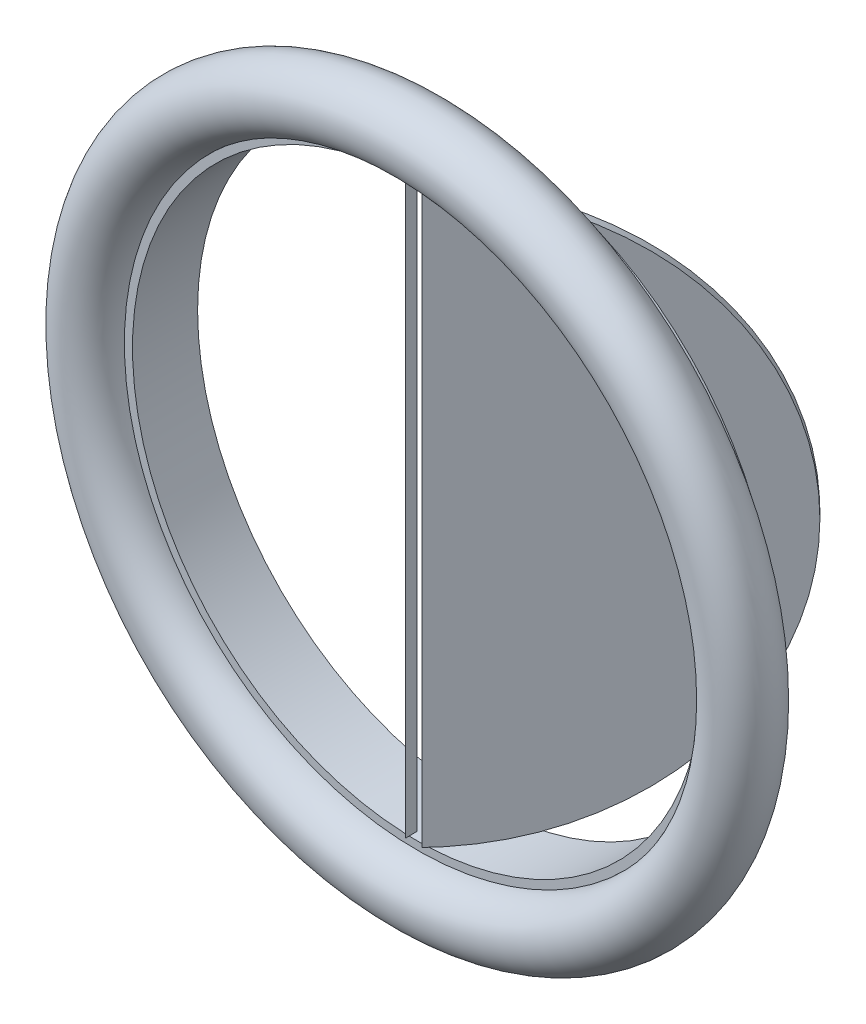
ISO-10303-21;
HEADER;
FILE_DESCRIPTION(('STEP AP214'),'2;1');
FILE_NAME('part.step','',(''),(''),'','','');
FILE_SCHEMA(('AUTOMOTIVE_DESIGN { 1 0 10303 214 1 1 1 1 }'));
ENDSEC;
DATA;
#1=APPLICATION_CONTEXT('core data for automotive mechanical design processes');
#2=APPLICATION_PROTOCOL_DEFINITION('international standard','automotive_design',2000,#1);
#3=PRODUCT_CONTEXT('',#1,'mechanical');
#4=PRODUCT('Part','Part','',(#3));
#5=PRODUCT_RELATED_PRODUCT_CATEGORY('part','',(#4));
#6=PRODUCT_DEFINITION_FORMATION('','',#4);
#7=PRODUCT_DEFINITION_CONTEXT('part definition',#1,'design');
#8=PRODUCT_DEFINITION('design','',#6,#7);
#9=PRODUCT_DEFINITION_SHAPE('','',#8);
#10=(LENGTH_UNIT() NAMED_UNIT(*) SI_UNIT(.MILLI.,.METRE.));
#11=(NAMED_UNIT(*) PLANE_ANGLE_UNIT() SI_UNIT($,.RADIAN.));
#12=(NAMED_UNIT(*) SI_UNIT($,.STERADIAN.) SOLID_ANGLE_UNIT());
#13=UNCERTAINTY_MEASURE_WITH_UNIT(LENGTH_MEASURE(1.E-05),#10,'distance_accuracy_value','');
#14=(GEOMETRIC_REPRESENTATION_CONTEXT(3) GLOBAL_UNCERTAINTY_ASSIGNED_CONTEXT((#13)) GLOBAL_UNIT_ASSIGNED_CONTEXT((#10,
#11,#12)) REPRESENTATION_CONTEXT('',''));
#15=CARTESIAN_POINT('',(0.,0.,0.));
#16=DIRECTION('',(0.,0.,1.));
#17=DIRECTION('',(1.,0.,0.));
#18=AXIS2_PLACEMENT_3D('',#15,#16,#17);
#19=CARTESIAN_POINT('',(0.,10.,0.));
#20=DIRECTION('',(0.,0.,1.));
#21=DIRECTION('',(1.,0.,0.));
#22=AXIS2_PLACEMENT_3D('',#19,#20,#21);
#23=PLANE('',#22);
#24=CARTESIAN_POINT('',(0.,10.,0.));
#25=DIRECTION('',(0.,0.,1.));
#26=DIRECTION('',(1.,0.,0.));
#27=AXIS2_PLACEMENT_3D('',#24,#25,#26);
#28=CIRCLE('',#27,9.);
#29=CARTESIAN_POINT('',(9.,10.,0.));
#30=VERTEX_POINT('',#29);
#31=EDGE_CURVE('E201',#30,#30,#28,.T.);
#32=ORIENTED_EDGE('',*,*,#31,.T.);
#33=EDGE_LOOP('',(#32));
#34=FACE_BOUND('',#33,.T.);
#35=CARTESIAN_POINT('',(0.,10.,0.));
#36=DIRECTION('',(0.,0.,1.));
#37=DIRECTION('',(1.,0.,0.));
#38=AXIS2_PLACEMENT_3D('',#35,#36,#37);
#39=CIRCLE('',#38,8.75);
#40=CARTESIAN_POINT('',(0.353553390593274,1.25714577497715,0.));
#41=VERTEX_POINT('',#40);
#42=CARTESIAN_POINT('',(0.353553390593277,18.7428542250229,0.));
#43=VERTEX_POINT('',#42);
#44=EDGE_CURVE('E205',#41,#43,#39,.T.);
#45=ORIENTED_EDGE('',*,*,#44,.F.);
#46=DIRECTION('',(0.,-1.,0.));
#47=VECTOR('',#46,1.);
#48=CARTESIAN_POINT('',(0.353553390593276,10.,0.));
#49=LINE('',#48,#47);
#50=CARTESIAN_POINT('',(0.353553390593275,1.25357215773205,0.));
#51=VERTEX_POINT('',#50);
#52=EDGE_CURVE('E61',#41,#51,#49,.T.);
#53=ORIENTED_EDGE('',*,*,#52,.T.);
#54=CARTESIAN_POINT('',(0.,10.,0.));
#55=DIRECTION('',(0.,0.,1.));
#56=DIRECTION('',(-1.,0.,0.));
#57=AXIS2_PLACEMENT_3D('',#54,#55,#56);
#58=ELLIPSE('',#57,12.3743686707646,8.75);
#59=CARTESIAN_POINT('',(0.25,1.25178589653865,0.));
#60=VERTEX_POINT('',#59);
#61=EDGE_CURVE('E65',#51,#60,#58,.F.);
#62=ORIENTED_EDGE('',*,*,#61,.T.);
#63=DIRECTION('',(0.,1.,0.));
#64=VECTOR('',#63,1.);
#65=CARTESIAN_POINT('',(0.25,10.,0.));
#66=LINE('',#65,#64);
#67=CARTESIAN_POINT('',(0.25,1.25357215773205,0.));
#68=VERTEX_POINT('',#67);
#69=EDGE_CURVE('E180',#60,#68,#66,.T.);
#70=ORIENTED_EDGE('',*,*,#69,.T.);
#71=CARTESIAN_POINT('',(-0.25,1.25357215773205,0.));
#72=VERTEX_POINT('',#71);
#73=EDGE_CURVE('E203',#72,#68,#39,.T.);
#74=ORIENTED_EDGE('',*,*,#73,.F.);
#75=DIRECTION('',(0.,1.,0.));
#76=VECTOR('',#75,1.);
#77=CARTESIAN_POINT('',(-0.25,18.9965271077233,0.));
#78=LINE('',#77,#76);
#79=CARTESIAN_POINT('',(-0.25,1.25178589653865,0.));
#80=VERTEX_POINT('',#79);
#81=EDGE_CURVE('E252',#80,#72,#78,.T.);
#82=ORIENTED_EDGE('',*,*,#81,.F.);
#83=CARTESIAN_POINT('',(0.,10.,0.));
#84=DIRECTION('',(0.,0.,1.));
#85=DIRECTION('',(1.,0.,0.));
#86=AXIS2_PLACEMENT_3D('',#83,#84,#85);
#87=ELLIPSE('',#86,12.3743686707646,8.75);
#88=CARTESIAN_POINT('',(-0.353553390593275,1.25357215773205,0.));
#89=VERTEX_POINT('',#88);
#90=EDGE_CURVE('E224',#80,#89,#87,.F.);
#91=ORIENTED_EDGE('',*,*,#90,.T.);
#92=DIRECTION('',(0.,-1.,0.));
#93=VECTOR('',#92,1.);
#94=CARTESIAN_POINT('',(-0.353553390593276,10.,0.));
#95=LINE('',#94,#93);
#96=CARTESIAN_POINT('',(-0.353553390593275,1.25714577497715,0.));
#97=VERTEX_POINT('',#96);
#98=EDGE_CURVE('E226',#97,#89,#95,.T.);
#99=ORIENTED_EDGE('',*,*,#98,.F.);
#100=CARTESIAN_POINT('',(-0.353553390593277,18.7428542250229,0.));
#101=VERTEX_POINT('',#100);
#102=EDGE_CURVE('E202',#101,#97,#39,.T.);
#103=ORIENTED_EDGE('',*,*,#102,.F.);
#104=CARTESIAN_POINT('',(-0.353553390593277,18.7464278422679,0.));
#105=VERTEX_POINT('',#104);
#106=EDGE_CURVE('E223',#105,#101,#95,.T.);
#107=ORIENTED_EDGE('',*,*,#106,.F.);
#108=CARTESIAN_POINT('',(-0.25,18.7482141034613,0.));
#109=VERTEX_POINT('',#108);
#110=EDGE_CURVE('E220',#105,#109,#87,.F.);
#111=ORIENTED_EDGE('',*,*,#110,.T.);
#112=CARTESIAN_POINT('',(-0.25,18.746427842268,0.));
#113=VERTEX_POINT('',#112);
#114=EDGE_CURVE('E249',#113,#109,#78,.T.);
#115=ORIENTED_EDGE('',*,*,#114,.F.);
#116=CARTESIAN_POINT('',(0.25,18.746427842268,0.));
#117=VERTEX_POINT('',#116);
#118=EDGE_CURVE('E206',#117,#113,#39,.T.);
#119=ORIENTED_EDGE('',*,*,#118,.F.);
#120=CARTESIAN_POINT('',(0.25,18.7482141034613,0.));
#121=VERTEX_POINT('',#120);
#122=EDGE_CURVE('E193',#117,#121,#66,.T.);
#123=ORIENTED_EDGE('',*,*,#122,.T.);
#124=CARTESIAN_POINT('',(0.353553390593277,18.7464278422679,0.));
#125=VERTEX_POINT('',#124);
#126=EDGE_CURVE('E197',#121,#125,#58,.F.);
#127=ORIENTED_EDGE('',*,*,#126,.T.);
#128=EDGE_CURVE('E194',#125,#43,#49,.T.);
#129=ORIENTED_EDGE('',*,*,#128,.T.);
#130=EDGE_LOOP('',(#45,#53,#62,#70,#74,#82,#91,#99,#103,#107,#111,#115,#119,#123,#127,#129));
#131=FACE_BOUND('',#130,.T.);
#132=ADVANCED_FACE('F44',(#34,#131),#23,.T.);
#133=CARTESIAN_POINT('',(0.,10.,-2.));
#134=DIRECTION('',(0.,0.,1.));
#135=DIRECTION('',(1.,0.,0.));
#136=AXIS2_PLACEMENT_3D('',#133,#134,#135);
#137=CYLINDRICAL_SURFACE('',#136,8.75);
#138=CARTESIAN_POINT('',(0.,10.,-2.));
#139=DIRECTION('',(0.,0.,1.));
#140=DIRECTION('',(1.,0.,0.));
#141=AXIS2_PLACEMENT_3D('',#138,#139,#140);
#142=CIRCLE('',#141,8.75);
#143=CARTESIAN_POINT('',(8.75,10.,-2.));
#144=VERTEX_POINT('',#143);
#145=EDGE_CURVE('E198',#144,#144,#142,.T.);
#146=ORIENTED_EDGE('',*,*,#145,.F.);
#147=EDGE_LOOP('',(#146));
#148=FACE_BOUND('',#147,.T.);
#149=CARTESIAN_POINT('',(0.,10.,0.353553390593274));
#150=DIRECTION('',(-0.707106781186546,0.,-0.707106781186549));
#151=DIRECTION('',(-0.707106781186549,0.,0.707106781186546));
#152=AXIS2_PLACEMENT_3D('',#149,#150,#151);
#153=ELLIPSE('',#152,12.3743686707646,8.75);
#154=CARTESIAN_POINT('',(0.603553390593278,18.7291593698765,-0.25));
#155=VERTEX_POINT('',#154);
#156=EDGE_CURVE('E12',#155,#43,#153,.F.);
#157=ORIENTED_EDGE('',*,*,#156,.F.);
#158=CARTESIAN_POINT('',(0.,10.,0.));
#159=DIRECTION('',(0.382683432365089,0.,0.923879532511287));
#160=DIRECTION('',(-0.923879532511287,0.,0.382683432365089));
#161=AXIS2_PLACEMENT_3D('',#158,#159,#160);
#162=ELLIPSE('',#161,9.47093175255844,8.75);
#163=CARTESIAN_POINT('',(0.25,18.746427842268,-0.10355339059311));
#164=VERTEX_POINT('',#163);
#165=EDGE_CURVE('E53',#164,#155,#162,.F.);
#166=ORIENTED_EDGE('',*,*,#165,.F.);
#167=DIRECTION('',(0.,0.,1.));
#168=VECTOR('',#167,1.);
#169=CARTESIAN_POINT('',(0.25,18.746427842268,-2.));
#170=LINE('',#169,#168);
#171=EDGE_CURVE('E48',#117,#164,#170,.F.);
#172=ORIENTED_EDGE('',*,*,#171,.F.);
#173=ORIENTED_EDGE('',*,*,#118,.T.);
#174=DIRECTION('',(0.,0.,1.));
#175=VECTOR('',#174,1.);
#176=CARTESIAN_POINT('',(-0.25,18.746427842268,-2.));
#177=LINE('',#176,#175);
#178=CARTESIAN_POINT('',(-0.25,18.746427842268,-0.103553390593113));
#179=VERTEX_POINT('',#178);
#180=EDGE_CURVE('E246',#113,#179,#177,.F.);
#181=ORIENTED_EDGE('',*,*,#180,.T.);
#182=CARTESIAN_POINT('',(0.,10.,0.));
#183=DIRECTION('',(0.382683432365089,0.,-0.923879532511287));
#184=DIRECTION('',(0.923879532511287,0.,0.382683432365089));
#185=AXIS2_PLACEMENT_3D('',#182,#183,#184);
#186=ELLIPSE('',#185,9.47093175255844,8.75);
#187=CARTESIAN_POINT('',(-0.603553390624951,18.729159369874,-0.250000000031674));
#188=VERTEX_POINT('',#187);
#189=EDGE_CURVE('E210',#188,#179,#186,.T.);
#190=ORIENTED_EDGE('',*,*,#189,.F.);
#191=CARTESIAN_POINT('',(0.,10.,0.353553390593275));
#192=DIRECTION('',(0.707106781186546,0.,-0.707106781186549));
#193=DIRECTION('',(0.707106781186549,0.,0.707106781186546));
#194=AXIS2_PLACEMENT_3D('',#191,#192,#193);
#195=ELLIPSE('',#194,12.3743686707646,8.75);
#196=EDGE_CURVE('E215',#188,#101,#195,.T.);
#197=ORIENTED_EDGE('',*,*,#196,.T.);
#198=ORIENTED_EDGE('',*,*,#102,.T.);
#199=CARTESIAN_POINT('',(-0.60355339062512,1.27084063012597,-0.250000000031845));
#200=VERTEX_POINT('',#199);
#201=EDGE_CURVE('E219',#97,#200,#195,.T.);
#202=ORIENTED_EDGE('',*,*,#201,.T.);
#203=CARTESIAN_POINT('',(-0.25,1.25357215773205,-0.103553390593386));
#204=VERTEX_POINT('',#203);
#205=EDGE_CURVE('E216',#204,#200,#186,.T.);
#206=ORIENTED_EDGE('',*,*,#205,.F.);
#207=DIRECTION('',(0.,0.,1.));
#208=VECTOR('',#207,1.);
#209=CARTESIAN_POINT('',(-0.25,1.25357215773205,-2.));
#210=LINE('',#209,#208);
#211=EDGE_CURVE('E251',#204,#72,#210,.T.);
#212=ORIENTED_EDGE('',*,*,#211,.T.);
#213=ORIENTED_EDGE('',*,*,#73,.T.);
#214=DIRECTION('',(0.,0.,1.));
#215=VECTOR('',#214,1.);
#216=CARTESIAN_POINT('',(0.25,1.25357215773205,-2.));
#217=LINE('',#216,#215);
#218=CARTESIAN_POINT('',(0.25,1.25357215773205,-0.103553390593383));
#219=VERTEX_POINT('',#218);
#220=EDGE_CURVE('E255',#219,#68,#217,.T.);
#221=ORIENTED_EDGE('',*,*,#220,.F.);
#222=CARTESIAN_POINT('',(0.603553390593275,1.27084063012346,-0.25));
#223=VERTEX_POINT('',#222);
#224=EDGE_CURVE('E167',#223,#219,#162,.F.);
#225=ORIENTED_EDGE('',*,*,#224,.F.);
#226=EDGE_CURVE('E54',#41,#223,#153,.F.);
#227=ORIENTED_EDGE('',*,*,#226,.F.);
#228=ORIENTED_EDGE('',*,*,#44,.T.);
#229=EDGE_LOOP('',(#157,#166,#172,#173,#181,#190,#197,#198,#202,#206,#212,#213,#221,#225,#227,#228));
#230=FACE_BOUND('',#229,.T.);
#231=ADVANCED_FACE('F283',(#148,#230),#137,.F.);
#232=CARTESIAN_POINT('',(-0.176776695296638,10.,0.176776695296637));
#233=DIRECTION('',(0.707106781186546,0.,-0.707106781186549));
#234=DIRECTION('',(-0.707106781186549,0.,-0.707106781186546));
#235=AXIS2_PLACEMENT_3D('',#232,#233,#234);
#236=CYLINDRICAL_SURFACE('',#235,8.75);
#237=CARTESIAN_POINT('',(-0.25,10.,0.249999999999999));
#238=DIRECTION('',(-1.,0.,0.));
#239=DIRECTION('',(0.,0.,-1.));
#240=AXIS2_PLACEMENT_3D('',#237,#238,#239);
#241=ELLIPSE('',#240,12.3743686707646,8.75);
#242=CARTESIAN_POINT('',(-0.25,1.25714577497714,-0.249999999999999));
#243=VERTEX_POINT('',#242);
#244=EDGE_CURVE('E231',#204,#243,#241,.F.);
#245=ORIENTED_EDGE('',*,*,#244,.F.);
#246=ORIENTED_EDGE('',*,*,#205,.T.);
#247=CARTESIAN_POINT('',(-0.176776695296638,10.,0.176776695296637));
#248=DIRECTION('',(0.707106781186546,0.,-0.707106781186549));
#249=DIRECTION('',(-0.707106781186549,0.,-0.707106781186546));
#250=AXIS2_PLACEMENT_3D('',#247,#248,#249);
#251=CIRCLE('',#250,8.75);
#252=EDGE_CURVE('E241',#200,#188,#251,.T.);
#253=ORIENTED_EDGE('',*,*,#252,.T.);
#254=ORIENTED_EDGE('',*,*,#189,.T.);
#255=CARTESIAN_POINT('',(-0.25,18.7428542250229,-0.249999999999997));
#256=VERTEX_POINT('',#255);
#257=EDGE_CURVE('E232',#256,#179,#241,.F.);
#258=ORIENTED_EDGE('',*,*,#257,.F.);
#259=CARTESIAN_POINT('',(0.,10.,0.));
#260=DIRECTION('',(0.707106781186546,0.,-0.707106781186549));
#261=DIRECTION('',(-0.707106781186549,0.,-0.707106781186546));
#262=AXIS2_PLACEMENT_3D('',#259,#260,#261);
#263=CIRCLE('',#262,8.75);
#264=EDGE_CURVE('E236',#243,#256,#263,.T.);
#265=ORIENTED_EDGE('',*,*,#264,.F.);
#266=EDGE_LOOP('',(#245,#246,#253,#254,#258,#265));
#267=FACE_BOUND('',#266,.T.);
#268=ADVANCED_FACE('F307',(#267),#236,.T.);
#269=ORIENTED_EDGE('',*,*,#90,.F.);
#270=CARTESIAN_POINT('',(-0.25,1.25061278172599,0.103553390593274));
#271=VERTEX_POINT('',#270);
#272=EDGE_CURVE('E227',#271,#80,#241,.F.);
#273=ORIENTED_EDGE('',*,*,#272,.F.);
#274=EDGE_CURVE('E237',#271,#89,#251,.T.);
#275=ORIENTED_EDGE('',*,*,#274,.T.);
#276=EDGE_LOOP('',(#269,#273,#275));
#277=FACE_BOUND('',#276,.T.);
#278=ADVANCED_FACE('F303',(#277),#236,.T.);
#279=ORIENTED_EDGE('',*,*,#110,.F.);
#280=CARTESIAN_POINT('',(-0.25,18.749387218274,0.103553390593277));
#281=VERTEX_POINT('',#280);
#282=EDGE_CURVE('E242',#105,#281,#251,.T.);
#283=ORIENTED_EDGE('',*,*,#282,.T.);
#284=EDGE_CURVE('E230',#109,#281,#241,.F.);
#285=ORIENTED_EDGE('',*,*,#284,.F.);
#286=EDGE_LOOP('',(#279,#283,#285));
#287=FACE_BOUND('',#286,.T.);
#288=ADVANCED_FACE('F46',(#287),#236,.T.);
#289=CARTESIAN_POINT('',(-0.176776695296638,10.,0.176776695296637));
#290=DIRECTION('',(0.707106781186546,0.,-0.707106781186549));
#291=DIRECTION('',(-0.707106781186549,0.,-0.707106781186546));
#292=AXIS2_PLACEMENT_3D('',#289,#290,#291);
#293=PLANE('',#292);
#294=ORIENTED_EDGE('',*,*,#201,.F.);
#295=ORIENTED_EDGE('',*,*,#98,.T.);
#296=ORIENTED_EDGE('',*,*,#274,.F.);
#297=DIRECTION('',(0.,1.,0.));
#298=VECTOR('',#297,1.);
#299=CARTESIAN_POINT('',(-0.25,10.,0.103553390593275));
#300=LINE('',#299,#298);
#301=EDGE_CURVE('E233',#271,#281,#300,.T.);
#302=ORIENTED_EDGE('',*,*,#301,.T.);
#303=ORIENTED_EDGE('',*,*,#282,.F.);
#304=ORIENTED_EDGE('',*,*,#106,.T.);
#305=ORIENTED_EDGE('',*,*,#196,.F.);
#306=ORIENTED_EDGE('',*,*,#252,.F.);
#307=EDGE_LOOP('',(#294,#295,#296,#302,#303,#304,#305,#306));
#308=FACE_BOUND('',#307,.T.);
#309=ADVANCED_FACE('F301',(#308),#293,.F.);
#310=CARTESIAN_POINT('',(0.,10.,0.));
#311=DIRECTION('',(0.707106781186546,0.,-0.707106781186549));
#312=DIRECTION('',(-0.707106781186549,0.,-0.707106781186546));
#313=AXIS2_PLACEMENT_3D('',#310,#311,#312);
#314=PLANE('',#313);
#315=DIRECTION('',(0.,1.,0.));
#316=VECTOR('',#315,1.);
#317=CARTESIAN_POINT('',(-0.25,10.,-0.249999999999998));
#318=LINE('',#317,#316);
#319=EDGE_CURVE('E240',#243,#256,#318,.T.);
#320=ORIENTED_EDGE('',*,*,#319,.F.);
#321=ORIENTED_EDGE('',*,*,#264,.T.);
#322=EDGE_LOOP('',(#320,#321));
#323=FACE_BOUND('',#322,.T.);
#324=ADVANCED_FACE('F312',(#323),#314,.T.);
#325=CARTESIAN_POINT('',(-0.25,18.9965271077233,-6.18718433538228));
#326=DIRECTION('',(-1.,0.,0.));
#327=DIRECTION('',(0.,0.,1.));
#328=AXIS2_PLACEMENT_3D('',#325,#326,#327);
#329=PLANE('',#328);
#330=ORIENTED_EDGE('',*,*,#272,.T.);
#331=ORIENTED_EDGE('',*,*,#81,.T.);
#332=ORIENTED_EDGE('',*,*,#211,.F.);
#333=ORIENTED_EDGE('',*,*,#244,.T.);
#334=ORIENTED_EDGE('',*,*,#319,.T.);
#335=ORIENTED_EDGE('',*,*,#257,.T.);
#336=ORIENTED_EDGE('',*,*,#180,.F.);
#337=ORIENTED_EDGE('',*,*,#114,.T.);
#338=ORIENTED_EDGE('',*,*,#284,.T.);
#339=ORIENTED_EDGE('',*,*,#301,.F.);
#340=EDGE_LOOP('',(#330,#331,#332,#333,#334,#335,#336,#337,#338,#339));
#341=FACE_BOUND('',#340,.T.);
#342=ADVANCED_FACE('F297',(#341),#329,.F.);
#343=CARTESIAN_POINT('',(0.,10.,-2.));
#344=DIRECTION('',(0.,0.,1.));
#345=DIRECTION('',(1.,0.,0.));
#346=AXIS2_PLACEMENT_3D('',#343,#344,#345);
#347=CYLINDRICAL_SURFACE('',#346,9.);
#348=CARTESIAN_POINT('',(0.,10.,-2.));
#349=DIRECTION('',(0.,0.,1.));
#350=DIRECTION('',(1.,0.,0.));
#351=AXIS2_PLACEMENT_3D('',#348,#349,#350);
#352=CIRCLE('',#351,9.);
#353=CARTESIAN_POINT('',(9.,10.,-2.));
#354=VERTEX_POINT('',#353);
#355=EDGE_CURVE('E207',#354,#354,#352,.T.);
#356=ORIENTED_EDGE('',*,*,#355,.T.);
#357=EDGE_LOOP('',(#356));
#358=FACE_BOUND('',#357,.T.);
#359=ORIENTED_EDGE('',*,*,#31,.F.);
#360=EDGE_LOOP('',(#359));
#361=FACE_BOUND('',#360,.T.);
#362=ADVANCED_FACE('F331',(#358,#361),#347,.T.);
#363=CARTESIAN_POINT('',(0.,10.,-2.));
#364=DIRECTION('',(0.,0.,1.));
#365=DIRECTION('',(1.,0.,0.));
#366=AXIS2_PLACEMENT_3D('',#363,#364,#365);
#367=PLANE('',#366);
#368=ORIENTED_EDGE('',*,*,#145,.T.);
#369=EDGE_LOOP('',(#368));
#370=FACE_BOUND('',#369,.T.);
#371=ORIENTED_EDGE('',*,*,#355,.F.);
#372=EDGE_LOOP('',(#371));
#373=FACE_BOUND('',#372,.T.);
#374=ADVANCED_FACE('F330',(#370,#373),#367,.F.);
#375=CARTESIAN_POINT('',(0.176776695296637,10.,0.176776695296639));
#376=DIRECTION('',(-0.707106781186546,0.,-0.707106781186549));
#377=DIRECTION('',(-0.707106781186549,0.,0.707106781186546));
#378=AXIS2_PLACEMENT_3D('',#375,#376,#377);
#379=CYLINDRICAL_SURFACE('',#378,8.75);
#380=CARTESIAN_POINT('',(0.25,10.,0.250000000000002));
#381=DIRECTION('',(1.,0.,0.));
#382=DIRECTION('',(0.,0.,-1.));
#383=AXIS2_PLACEMENT_3D('',#380,#381,#382);
#384=ELLIPSE('',#383,12.3743686707646,8.75);
#385=CARTESIAN_POINT('',(0.25,18.7428542250229,-0.249999999999997));
#386=VERTEX_POINT('',#385);
#387=EDGE_CURVE('E178',#386,#164,#384,.T.);
#388=ORIENTED_EDGE('',*,*,#387,.T.);
#389=ORIENTED_EDGE('',*,*,#165,.T.);
#390=CARTESIAN_POINT('',(0.176776695296637,10.,0.176776695296639));
#391=DIRECTION('',(0.707106781186546,0.,0.707106781186549));
#392=DIRECTION('',(-0.707106781186549,0.,0.707106781186546));
#393=AXIS2_PLACEMENT_3D('',#390,#391,#392);
#394=CIRCLE('',#393,8.75);
#395=EDGE_CURVE('E187',#223,#155,#394,.T.);
#396=ORIENTED_EDGE('',*,*,#395,.F.);
#397=ORIENTED_EDGE('',*,*,#224,.T.);
#398=CARTESIAN_POINT('',(0.25,1.25714577497714,-0.249999999999999));
#399=VERTEX_POINT('',#398);
#400=EDGE_CURVE('E160',#219,#399,#384,.T.);
#401=ORIENTED_EDGE('',*,*,#400,.T.);
#402=CARTESIAN_POINT('',(0.,10.,0.));
#403=DIRECTION('',(0.707106781186546,0.,0.707106781186549));
#404=DIRECTION('',(-0.707106781186549,0.,0.707106781186546));
#405=AXIS2_PLACEMENT_3D('',#402,#403,#404);
#406=CIRCLE('',#405,8.75);
#407=EDGE_CURVE('E165',#399,#386,#406,.T.);
#408=ORIENTED_EDGE('',*,*,#407,.T.);
#409=EDGE_LOOP('',(#388,#389,#396,#397,#401,#408));
#410=FACE_BOUND('',#409,.T.);
#411=ADVANCED_FACE('F163',(#410),#379,.T.);
#412=ORIENTED_EDGE('',*,*,#126,.F.);
#413=CARTESIAN_POINT('',(0.25,18.749387218274,0.103553390593277));
#414=VERTEX_POINT('',#413);
#415=EDGE_CURVE('E172',#121,#414,#384,.T.);
#416=ORIENTED_EDGE('',*,*,#415,.T.);
#417=EDGE_CURVE('E184',#125,#414,#394,.T.);
#418=ORIENTED_EDGE('',*,*,#417,.F.);
#419=EDGE_LOOP('',(#412,#416,#418));
#420=FACE_BOUND('',#419,.T.);
#421=ADVANCED_FACE('F275',(#420),#379,.T.);
#422=ORIENTED_EDGE('',*,*,#61,.F.);
#423=CARTESIAN_POINT('',(0.25,1.25061278172599,0.103553390593274));
#424=VERTEX_POINT('',#423);
#425=EDGE_CURVE('E181',#424,#51,#394,.T.);
#426=ORIENTED_EDGE('',*,*,#425,.F.);
#427=EDGE_CURVE('E170',#424,#60,#384,.T.);
#428=ORIENTED_EDGE('',*,*,#427,.T.);
#429=EDGE_LOOP('',(#422,#426,#428));
#430=FACE_BOUND('',#429,.T.);
#431=ADVANCED_FACE('F269',(#430),#379,.T.);
#432=CARTESIAN_POINT('',(0.176776695296637,10.,0.176776695296639));
#433=DIRECTION('',(-0.707106781186546,0.,-0.707106781186549));
#434=DIRECTION('',(-0.707106781186549,0.,0.707106781186546));
#435=AXIS2_PLACEMENT_3D('',#432,#433,#434);
#436=PLANE('',#435);
#437=ORIENTED_EDGE('',*,*,#52,.F.);
#438=ORIENTED_EDGE('',*,*,#226,.T.);
#439=ORIENTED_EDGE('',*,*,#395,.T.);
#440=ORIENTED_EDGE('',*,*,#156,.T.);
#441=ORIENTED_EDGE('',*,*,#128,.F.);
#442=ORIENTED_EDGE('',*,*,#417,.T.);
#443=DIRECTION('',(0.,-1.,0.));
#444=VECTOR('',#443,1.);
#445=CARTESIAN_POINT('',(0.25,10.,0.103553390593275));
#446=LINE('',#445,#444);
#447=EDGE_CURVE('E185',#414,#424,#446,.T.);
#448=ORIENTED_EDGE('',*,*,#447,.T.);
#449=ORIENTED_EDGE('',*,*,#425,.T.);
#450=EDGE_LOOP('',(#437,#438,#439,#440,#441,#442,#448,#449));
#451=FACE_BOUND('',#450,.T.);
#452=ADVANCED_FACE('F262',(#451),#436,.F.);
#453=CARTESIAN_POINT('',(0.,10.,0.));
#454=DIRECTION('',(-0.707106781186546,0.,-0.707106781186549));
#455=DIRECTION('',(-0.707106781186549,0.,0.707106781186546));
#456=AXIS2_PLACEMENT_3D('',#453,#454,#455);
#457=PLANE('',#456);
#458=DIRECTION('',(0.,-1.,0.));
#459=VECTOR('',#458,1.);
#460=CARTESIAN_POINT('',(0.25,10.,-0.249999999999998));
#461=LINE('',#460,#459);
#462=EDGE_CURVE('E174',#386,#399,#461,.T.);
#463=ORIENTED_EDGE('',*,*,#462,.F.);
#464=ORIENTED_EDGE('',*,*,#407,.F.);
#465=EDGE_LOOP('',(#463,#464));
#466=FACE_BOUND('',#465,.T.);
#467=ADVANCED_FACE('F183',(#466),#457,.T.);
#468=CARTESIAN_POINT('',(0.25,18.9965271077233,-6.18718433538228));
#469=DIRECTION('',(1.,0.,0.));
#470=DIRECTION('',(0.,0.,-1.));
#471=AXIS2_PLACEMENT_3D('',#468,#469,#470);
#472=PLANE('',#471);
#473=ORIENTED_EDGE('',*,*,#122,.F.);
#474=ORIENTED_EDGE('',*,*,#171,.T.);
#475=ORIENTED_EDGE('',*,*,#387,.F.);
#476=ORIENTED_EDGE('',*,*,#462,.T.);
#477=ORIENTED_EDGE('',*,*,#400,.F.);
#478=ORIENTED_EDGE('',*,*,#220,.T.);
#479=ORIENTED_EDGE('',*,*,#69,.F.);
#480=ORIENTED_EDGE('',*,*,#427,.F.);
#481=ORIENTED_EDGE('',*,*,#447,.F.);
#482=ORIENTED_EDGE('',*,*,#415,.F.);
#483=EDGE_LOOP('',(#473,#474,#475,#476,#477,#478,#479,#480,#481,#482));
#484=FACE_BOUND('',#483,.T.);
#485=ADVANCED_FACE('F176',(#484),#472,.F.);
#486=CLOSED_SHELL('',(#132,#231,#268,#278,#288,#309,#324,#342,#362,#374,#411,#421,#431,#452,
#467,#485));
#487=MANIFOLD_SOLID_BREP('B2',#486);
#488=CARTESIAN_POINT('',(0.,10.,0.));
#489=DIRECTION('',(0.,0.,1.));
#490=DIRECTION('',(1.,0.,0.));
#491=AXIS2_PLACEMENT_3D('',#488,#489,#490);
#492=TOROIDAL_SURFACE('',#491,10.,1.);
#493=CARTESIAN_POINT('',(11.,10.,0.));
#494=VERTEX_POINT('',#493);
#495=VERTEX_LOOP('',#494);
#496=FACE_BOUND('',#495,.T.);
#497=ADVANCED_FACE('F464',(#496),#492,.T.);
#498=CLOSED_SHELL('',(#497));
#499=MANIFOLD_SOLID_BREP('B6',#498);
#500=ADVANCED_BREP_SHAPE_REPRESENTATION('',(#18,#487,#499),#14);
#501=SHAPE_DEFINITION_REPRESENTATION(#9,#500);
ENDSEC;
END-ISO-10303-21;
